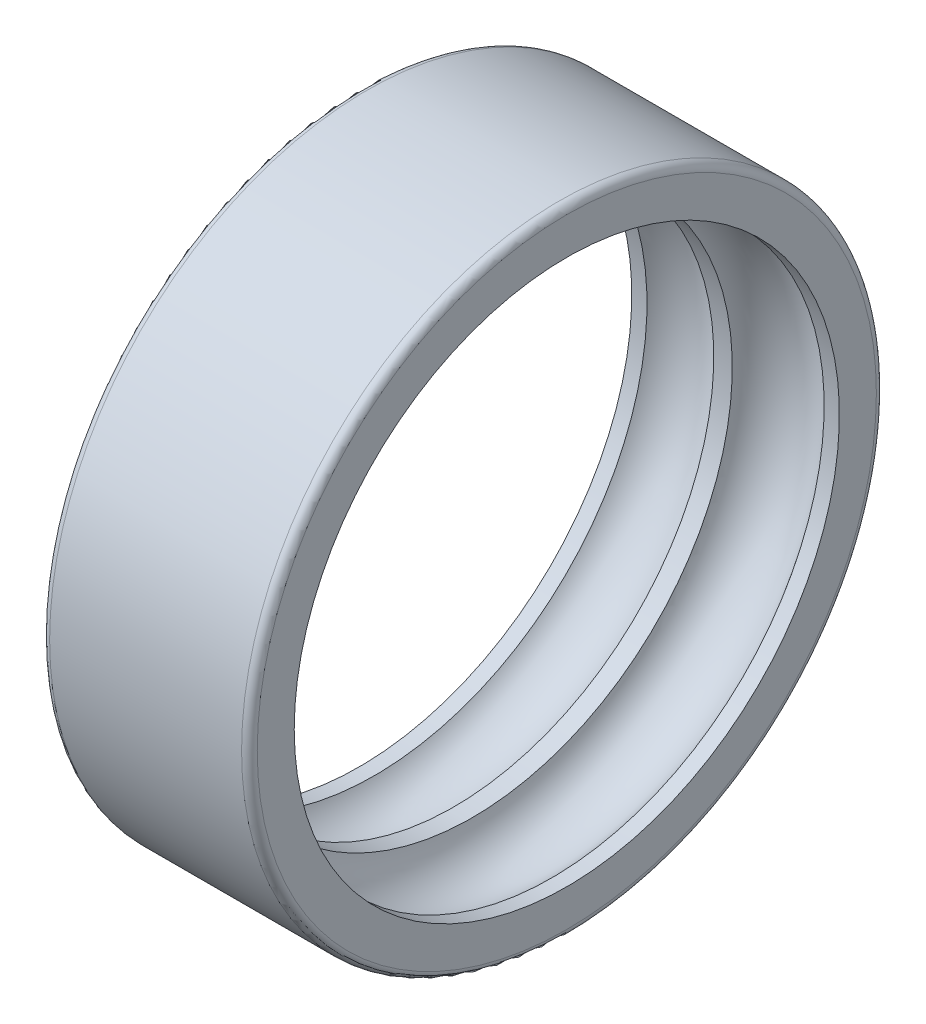
ISO-10303-21;
HEADER;
FILE_DESCRIPTION(('STEP AP214'),'2;1');
FILE_NAME('part.step','',(''),(''),'','','');
FILE_SCHEMA(('AUTOMOTIVE_DESIGN { 1 0 10303 214 1 1 1 1 }'));
ENDSEC;
DATA;
#1=APPLICATION_CONTEXT('core data for automotive mechanical design processes');
#2=APPLICATION_PROTOCOL_DEFINITION('international standard','automotive_design',2000,#1);
#3=PRODUCT_CONTEXT('',#1,'mechanical');
#4=PRODUCT('Part','Part','',(#3));
#5=PRODUCT_RELATED_PRODUCT_CATEGORY('part','',(#4));
#6=PRODUCT_DEFINITION_FORMATION('','',#4);
#7=PRODUCT_DEFINITION_CONTEXT('part definition',#1,'design');
#8=PRODUCT_DEFINITION('design','',#6,#7);
#9=PRODUCT_DEFINITION_SHAPE('','',#8);
#10=(LENGTH_UNIT() NAMED_UNIT(*) SI_UNIT(.MILLI.,.METRE.));
#11=(NAMED_UNIT(*) PLANE_ANGLE_UNIT() SI_UNIT($,.RADIAN.));
#12=(NAMED_UNIT(*) SI_UNIT($,.STERADIAN.) SOLID_ANGLE_UNIT());
#13=UNCERTAINTY_MEASURE_WITH_UNIT(LENGTH_MEASURE(1.E-05),#10,'distance_accuracy_value','');
#14=(GEOMETRIC_REPRESENTATION_CONTEXT(3) GLOBAL_UNCERTAINTY_ASSIGNED_CONTEXT((#13)) GLOBAL_UNIT_ASSIGNED_CONTEXT((#10,
#11,#12)) REPRESENTATION_CONTEXT('',''));
#15=CARTESIAN_POINT('',(0.,0.,0.));
#16=DIRECTION('',(0.,0.,1.));
#17=DIRECTION('',(1.,0.,0.));
#18=AXIS2_PLACEMENT_3D('',#15,#16,#17);
#19=CARTESIAN_POINT('',(2.09999999999958,0.,0.));
#20=DIRECTION('',(-1.,0.,0.));
#21=DIRECTION('',(0.,0.,1.));
#22=AXIS2_PLACEMENT_3D('',#19,#20,#21);
#23=TOROIDAL_SURFACE('',#22,82.9000000000004,2.09999999999958);
#24=CARTESIAN_POINT('',(0.,0.,0.));
#25=DIRECTION('',(-1.,0.,0.));
#26=DIRECTION('',(0.,0.,1.));
#27=AXIS2_PLACEMENT_3D('',#24,#25,#26);
#28=CIRCLE('',#27,82.9);
#29=CARTESIAN_POINT('',(0.,0.,82.9));
#30=VERTEX_POINT('',#29);
#31=EDGE_CURVE('E10',#30,#30,#28,.T.);
#32=ORIENTED_EDGE('',*,*,#31,.F.);
#33=EDGE_LOOP('',(#32));
#34=FACE_BOUND('',#33,.T.);
#35=CARTESIAN_POINT('',(2.1,0.,0.));
#36=DIRECTION('',(-1.,0.,0.));
#37=DIRECTION('',(0.,0.,1.));
#38=AXIS2_PLACEMENT_3D('',#35,#36,#37);
#39=CIRCLE('',#38,85.);
#40=CARTESIAN_POINT('',(2.1,0.,85.));
#41=VERTEX_POINT('',#40);
#42=EDGE_CURVE('E65',#41,#41,#39,.T.);
#43=ORIENTED_EDGE('',*,*,#42,.T.);
#44=EDGE_LOOP('',(#43));
#45=FACE_BOUND('',#44,.T.);
#46=ADVANCED_FACE('F31',(#34,#45),#23,.T.);
#47=CARTESIAN_POINT('',(0.,82.9,0.));
#48=DIRECTION('',(1.,0.,0.));
#49=DIRECTION('',(0.,0.,-1.));
#50=AXIS2_PLACEMENT_3D('',#47,#48,#49);
#51=PLANE('',#50);
#52=CARTESIAN_POINT('',(0.,0.,0.));
#53=DIRECTION('',(-1.,0.,0.));
#54=DIRECTION('',(0.,0.,1.));
#55=AXIS2_PLACEMENT_3D('',#52,#53,#54);
#56=CIRCLE('',#55,73.);
#57=CARTESIAN_POINT('',(0.,0.,73.));
#58=VERTEX_POINT('',#57);
#59=EDGE_CURVE('E37',#58,#58,#56,.T.);
#60=ORIENTED_EDGE('',*,*,#59,.F.);
#61=EDGE_LOOP('',(#60));
#62=FACE_BOUND('',#61,.T.);
#63=ORIENTED_EDGE('',*,*,#31,.T.);
#64=EDGE_LOOP('',(#63));
#65=FACE_BOUND('',#64,.T.);
#66=ADVANCED_FACE('F114',(#62,#65),#51,.F.);
#67=CARTESIAN_POINT('',(27.8,0.,0.));
#68=DIRECTION('',(-1.,0.,0.));
#69=DIRECTION('',(0.,0.,1.));
#70=AXIS2_PLACEMENT_3D('',#67,#68,#69);
#71=CYLINDRICAL_SURFACE('',#70,73.);
#72=CARTESIAN_POINT('',(4.0751737419942,0.,0.));
#73=DIRECTION('',(-1.,0.,0.));
#74=DIRECTION('',(0.,0.,1.));
#75=AXIS2_PLACEMENT_3D('',#72,#73,#74);
#76=CIRCLE('',#75,73.);
#77=CARTESIAN_POINT('',(4.0751737419942,0.,73.));
#78=VERTEX_POINT('',#77);
#79=EDGE_CURVE('E41',#78,#78,#76,.T.);
#80=ORIENTED_EDGE('',*,*,#79,.F.);
#81=EDGE_LOOP('',(#80));
#82=FACE_BOUND('',#81,.T.);
#83=ORIENTED_EDGE('',*,*,#59,.T.);
#84=EDGE_LOOP('',(#83));
#85=FACE_BOUND('',#84,.T.);
#86=ADVANCED_FACE('F109',(#82,#85),#71,.F.);
#87=CARTESIAN_POINT('',(13.8999999999999,0.,0.));
#88=DIRECTION('',(-1.,0.,0.));
#89=DIRECTION('',(0.,0.,1.));
#90=AXIS2_PLACEMENT_3D('',#87,#88,#89);
#91=TOROIDAL_SURFACE('',#90,66.2749999999998,11.9060000000001);
#92=CARTESIAN_POINT('',(25.321314711976,0.,0.));
#93=DIRECTION('',(-1.,0.,0.));
#94=DIRECTION('',(0.,0.,1.));
#95=AXIS2_PLACEMENT_3D('',#92,#93,#94);
#96=CIRCLE('',#95,69.6375);
#97=CARTESIAN_POINT('',(25.321314711976,0.,69.6375));
#98=VERTEX_POINT('',#97);
#99=EDGE_CURVE('E45',#98,#98,#96,.T.);
#100=ORIENTED_EDGE('',*,*,#99,.F.);
#101=EDGE_LOOP('',(#100));
#102=FACE_BOUND('',#101,.T.);
#103=ORIENTED_EDGE('',*,*,#79,.T.);
#104=EDGE_LOOP('',(#103));
#105=FACE_BOUND('',#104,.T.);
#106=ADVANCED_FACE('F103',(#102,#105),#91,.F.);
#107=CARTESIAN_POINT('',(27.8,0.,0.));
#108=DIRECTION('',(-1.,0.,0.));
#109=DIRECTION('',(0.,0.,1.));
#110=AXIS2_PLACEMENT_3D('',#107,#108,#109);
#111=CYLINDRICAL_SURFACE('',#110,69.6375);
#112=CARTESIAN_POINT('',(30.278685288024,0.,0.));
#113=DIRECTION('',(-1.,0.,0.));
#114=DIRECTION('',(0.,0.,1.));
#115=AXIS2_PLACEMENT_3D('',#112,#113,#114);
#116=CIRCLE('',#115,69.6375);
#117=CARTESIAN_POINT('',(30.278685288024,0.,69.6375));
#118=VERTEX_POINT('',#117);
#119=EDGE_CURVE('E50',#118,#118,#116,.T.);
#120=ORIENTED_EDGE('',*,*,#119,.F.);
#121=EDGE_LOOP('',(#120));
#122=FACE_BOUND('',#121,.T.);
#123=ORIENTED_EDGE('',*,*,#99,.T.);
#124=EDGE_LOOP('',(#123));
#125=FACE_BOUND('',#124,.T.);
#126=ADVANCED_FACE('F97',(#122,#125),#111,.F.);
#127=CARTESIAN_POINT('',(41.7000000000002,0.,0.));
#128=DIRECTION('',(-1.,0.,0.));
#129=DIRECTION('',(0.,0.,1.));
#130=AXIS2_PLACEMENT_3D('',#127,#128,#129);
#131=TOROIDAL_SURFACE('',#130,66.2749999999996,11.9060000000002);
#132=CARTESIAN_POINT('',(51.524826258006,0.,0.));
#133=DIRECTION('',(-1.,0.,0.));
#134=DIRECTION('',(0.,0.,1.));
#135=AXIS2_PLACEMENT_3D('',#132,#133,#134);
#136=CIRCLE('',#135,73.);
#137=CARTESIAN_POINT('',(51.524826258006,0.,73.));
#138=VERTEX_POINT('',#137);
#139=EDGE_CURVE('E53',#138,#138,#136,.T.);
#140=ORIENTED_EDGE('',*,*,#139,.F.);
#141=EDGE_LOOP('',(#140));
#142=FACE_BOUND('',#141,.T.);
#143=ORIENTED_EDGE('',*,*,#119,.T.);
#144=EDGE_LOOP('',(#143));
#145=FACE_BOUND('',#144,.T.);
#146=ADVANCED_FACE('F91',(#142,#145),#131,.F.);
#147=CARTESIAN_POINT('',(27.8,0.,0.));
#148=DIRECTION('',(-1.,0.,0.));
#149=DIRECTION('',(0.,0.,1.));
#150=AXIS2_PLACEMENT_3D('',#147,#148,#149);
#151=CYLINDRICAL_SURFACE('',#150,73.);
#152=CARTESIAN_POINT('',(55.6,0.,0.));
#153=DIRECTION('',(-1.,0.,0.));
#154=DIRECTION('',(0.,0.,1.));
#155=AXIS2_PLACEMENT_3D('',#152,#153,#154);
#156=CIRCLE('',#155,73.);
#157=CARTESIAN_POINT('',(55.6,0.,73.));
#158=VERTEX_POINT('',#157);
#159=EDGE_CURVE('E56',#158,#158,#156,.T.);
#160=ORIENTED_EDGE('',*,*,#159,.F.);
#161=EDGE_LOOP('',(#160));
#162=FACE_BOUND('',#161,.T.);
#163=ORIENTED_EDGE('',*,*,#139,.T.);
#164=EDGE_LOOP('',(#163));
#165=FACE_BOUND('',#164,.T.);
#166=ADVANCED_FACE('F85',(#162,#165),#151,.F.);
#167=CARTESIAN_POINT('',(55.6,73.,0.));
#168=DIRECTION('',(-1.,0.,0.));
#169=DIRECTION('',(0.,0.,1.));
#170=AXIS2_PLACEMENT_3D('',#167,#168,#169);
#171=PLANE('',#170);
#172=CARTESIAN_POINT('',(55.6,0.,0.));
#173=DIRECTION('',(-1.,0.,0.));
#174=DIRECTION('',(0.,0.,1.));
#175=AXIS2_PLACEMENT_3D('',#172,#173,#174);
#176=CIRCLE('',#175,82.9);
#177=CARTESIAN_POINT('',(55.6,0.,82.9));
#178=VERTEX_POINT('',#177);
#179=EDGE_CURVE('E59',#178,#178,#176,.T.);
#180=ORIENTED_EDGE('',*,*,#179,.F.);
#181=EDGE_LOOP('',(#180));
#182=FACE_BOUND('',#181,.T.);
#183=ORIENTED_EDGE('',*,*,#159,.T.);
#184=EDGE_LOOP('',(#183));
#185=FACE_BOUND('',#184,.T.);
#186=ADVANCED_FACE('F79',(#182,#185),#171,.F.);
#187=CARTESIAN_POINT('',(53.5000000000009,0.,0.));
#188=DIRECTION('',(-1.,0.,0.));
#189=DIRECTION('',(0.,0.,1.));
#190=AXIS2_PLACEMENT_3D('',#187,#188,#189);
#191=TOROIDAL_SURFACE('',#190,82.9000000000009,2.09999999999914);
#192=CARTESIAN_POINT('',(53.5,0.,0.));
#193=DIRECTION('',(-1.,0.,0.));
#194=DIRECTION('',(0.,0.,1.));
#195=AXIS2_PLACEMENT_3D('',#192,#193,#194);
#196=CIRCLE('',#195,85.);
#197=CARTESIAN_POINT('',(53.5,0.,85.));
#198=VERTEX_POINT('',#197);
#199=EDGE_CURVE('E62',#198,#198,#196,.T.);
#200=ORIENTED_EDGE('',*,*,#199,.F.);
#201=EDGE_LOOP('',(#200));
#202=FACE_BOUND('',#201,.T.);
#203=ORIENTED_EDGE('',*,*,#179,.T.);
#204=EDGE_LOOP('',(#203));
#205=FACE_BOUND('',#204,.T.);
#206=ADVANCED_FACE('F73',(#202,#205),#191,.T.);
#207=CARTESIAN_POINT('',(27.8,0.,0.));
#208=DIRECTION('',(-1.,0.,0.));
#209=DIRECTION('',(0.,0.,1.));
#210=AXIS2_PLACEMENT_3D('',#207,#208,#209);
#211=CYLINDRICAL_SURFACE('',#210,85.);
#212=ORIENTED_EDGE('',*,*,#42,.F.);
#213=EDGE_LOOP('',(#212));
#214=FACE_BOUND('',#213,.T.);
#215=ORIENTED_EDGE('',*,*,#199,.T.);
#216=EDGE_LOOP('',(#215));
#217=FACE_BOUND('',#216,.T.);
#218=ADVANCED_FACE('F70',(#214,#217),#211,.T.);
#219=CLOSED_SHELL('',(#46,#66,#86,#106,#126,#146,#166,#186,#206,#218));
#220=MANIFOLD_SOLID_BREP('B2',#219);
#221=ADVANCED_BREP_SHAPE_REPRESENTATION('',(#18,#220),#14);
#222=SHAPE_DEFINITION_REPRESENTATION(#9,#221);
ENDSEC;
END-ISO-10303-21;
